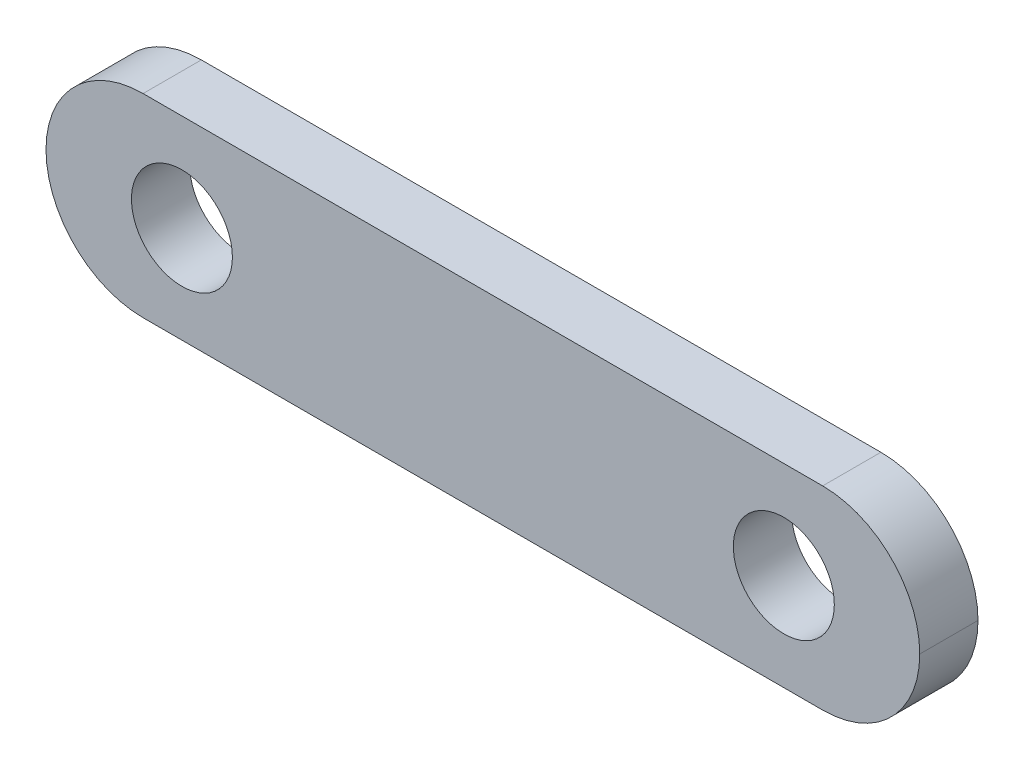
ISO-10303-21;
HEADER;
FILE_DESCRIPTION(('STEP AP214'),'2;1');
FILE_NAME('part.step','',(''),(''),'','','');
FILE_SCHEMA(('AUTOMOTIVE_DESIGN { 1 0 10303 214 1 1 1 1 }'));
ENDSEC;
DATA;
#1=APPLICATION_CONTEXT('core data for automotive mechanical design processes');
#2=APPLICATION_PROTOCOL_DEFINITION('international standard','automotive_design',2000,#1);
#3=PRODUCT_CONTEXT('',#1,'mechanical');
#4=PRODUCT('Part','Part','',(#3));
#5=PRODUCT_RELATED_PRODUCT_CATEGORY('part','',(#4));
#6=PRODUCT_DEFINITION_FORMATION('','',#4);
#7=PRODUCT_DEFINITION_CONTEXT('part definition',#1,'design');
#8=PRODUCT_DEFINITION('design','',#6,#7);
#9=PRODUCT_DEFINITION_SHAPE('','',#8);
#10=(LENGTH_UNIT() NAMED_UNIT(*) SI_UNIT(.MILLI.,.METRE.));
#11=(NAMED_UNIT(*) PLANE_ANGLE_UNIT() SI_UNIT($,.RADIAN.));
#12=(NAMED_UNIT(*) SI_UNIT($,.STERADIAN.) SOLID_ANGLE_UNIT());
#13=UNCERTAINTY_MEASURE_WITH_UNIT(LENGTH_MEASURE(1.E-05),#10,'distance_accuracy_value','');
#14=(GEOMETRIC_REPRESENTATION_CONTEXT(3) GLOBAL_UNCERTAINTY_ASSIGNED_CONTEXT((#13)) GLOBAL_UNIT_ASSIGNED_CONTEXT((#10,
#11,#12)) REPRESENTATION_CONTEXT('',''));
#15=CARTESIAN_POINT('',(0.,0.,0.));
#16=DIRECTION('',(0.,0.,1.));
#17=DIRECTION('',(1.,0.,0.));
#18=AXIS2_PLACEMENT_3D('',#15,#16,#17);
#19=CARTESIAN_POINT('',(-47.7032570422535,1.02306338028169,3.));
#20=DIRECTION('',(0.,1.,0.));
#21=DIRECTION('',(0.,0.,1.));
#22=AXIS2_PLACEMENT_3D('',#19,#20,#21);
#23=PLANE('',#22);
#24=DIRECTION('',(1.,0.,0.));
#25=VECTOR('',#24,1.);
#26=CARTESIAN_POINT('',(-47.7032570422535,1.02306338028169,3.));
#27=LINE('',#26,#25);
#28=CARTESIAN_POINT('',(-42.7032570422535,1.02306338028169,3.));
#29=VERTEX_POINT('',#28);
#30=CARTESIAN_POINT('',(-7.70325704225352,1.02306338028169,3.));
#31=VERTEX_POINT('',#30);
#32=EDGE_CURVE('E107',#29,#31,#27,.T.);
#33=ORIENTED_EDGE('',*,*,#32,.F.);
#34=DIRECTION('',(0.,0.,-1.));
#35=VECTOR('',#34,1.);
#36=CARTESIAN_POINT('',(-42.7032570422535,1.02306338028169,3.));
#37=LINE('',#36,#35);
#38=CARTESIAN_POINT('',(-42.7032570422535,1.02306338028169,0.));
#39=VERTEX_POINT('',#38);
#40=EDGE_CURVE('E91',#29,#39,#37,.T.);
#41=ORIENTED_EDGE('',*,*,#40,.T.);
#42=DIRECTION('',(1.,0.,0.));
#43=VECTOR('',#42,1.);
#44=CARTESIAN_POINT('',(-47.7032570422535,1.02306338028169,0.));
#45=LINE('',#44,#43);
#46=CARTESIAN_POINT('',(-7.70325704225352,1.02306338028169,0.));
#47=VERTEX_POINT('',#46);
#48=EDGE_CURVE('E104',#39,#47,#45,.T.);
#49=ORIENTED_EDGE('',*,*,#48,.T.);
#50=DIRECTION('',(0.,0.,-1.));
#51=VECTOR('',#50,1.);
#52=CARTESIAN_POINT('',(-7.7032570422535,1.02306338028169,3.));
#53=LINE('',#52,#51);
#54=EDGE_CURVE('E108',#47,#31,#53,.F.);
#55=ORIENTED_EDGE('',*,*,#54,.T.);
#56=EDGE_LOOP('',(#33,#41,#49,#55));
#57=FACE_BOUND('',#56,.T.);
#58=ADVANCED_FACE('F36',(#57),#23,.F.);
#59=CARTESIAN_POINT('',(-47.7032570422535,11.0230633802817,3.));
#60=DIRECTION('',(0.,-1.,0.));
#61=DIRECTION('',(0.,0.,-1.));
#62=AXIS2_PLACEMENT_3D('',#59,#60,#61);
#63=PLANE('',#62);
#64=DIRECTION('',(-1.,0.,0.));
#65=VECTOR('',#64,1.);
#66=CARTESIAN_POINT('',(-47.7032570422535,11.0230633802817,3.));
#67=LINE('',#66,#65);
#68=CARTESIAN_POINT('',(-7.70325704225352,11.0230633802817,3.));
#69=VERTEX_POINT('',#68);
#70=CARTESIAN_POINT('',(-42.7032570422535,11.0230633802817,3.));
#71=VERTEX_POINT('',#70);
#72=EDGE_CURVE('E123',#69,#71,#67,.T.);
#73=ORIENTED_EDGE('',*,*,#72,.F.);
#74=DIRECTION('',(0.,0.,-1.));
#75=VECTOR('',#74,1.);
#76=CARTESIAN_POINT('',(-7.7032570422535,11.0230633802817,3.));
#77=LINE('',#76,#75);
#78=CARTESIAN_POINT('',(-7.70325704225352,11.0230633802817,0.));
#79=VERTEX_POINT('',#78);
#80=EDGE_CURVE('E11',#69,#79,#77,.T.);
#81=ORIENTED_EDGE('',*,*,#80,.T.);
#82=DIRECTION('',(-1.,0.,0.));
#83=VECTOR('',#82,1.);
#84=CARTESIAN_POINT('',(-47.7032570422535,11.0230633802817,0.));
#85=LINE('',#84,#83);
#86=CARTESIAN_POINT('',(-42.7032570422535,11.0230633802817,0.));
#87=VERTEX_POINT('',#86);
#88=EDGE_CURVE('E113',#79,#87,#85,.T.);
#89=ORIENTED_EDGE('',*,*,#88,.T.);
#90=DIRECTION('',(0.,0.,-1.));
#91=VECTOR('',#90,1.);
#92=CARTESIAN_POINT('',(-42.7032570422535,11.0230633802817,3.));
#93=LINE('',#92,#91);
#94=EDGE_CURVE('E43',#87,#71,#93,.F.);
#95=ORIENTED_EDGE('',*,*,#94,.T.);
#96=EDGE_LOOP('',(#73,#81,#89,#95));
#97=FACE_BOUND('',#96,.T.);
#98=ADVANCED_FACE('F159',(#97),#63,.F.);
#99=CARTESIAN_POINT('',(-47.7032570422535,1.02306338028169,3.));
#100=DIRECTION('',(0.,0.,1.));
#101=DIRECTION('',(1.,0.,0.));
#102=AXIS2_PLACEMENT_3D('',#99,#100,#101);
#103=PLANE('',#102);
#104=CARTESIAN_POINT('',(-9.70325704225351,6.02306338028169,3.));
#105=DIRECTION('',(0.,0.,1.));
#106=DIRECTION('',(1.,0.,0.));
#107=AXIS2_PLACEMENT_3D('',#104,#105,#106);
#108=CIRCLE('',#107,2.6);
#109=CARTESIAN_POINT('',(-7.10325704225351,6.02306338028169,3.));
#110=VERTEX_POINT('',#109);
#111=EDGE_CURVE('E146',#110,#110,#108,.T.);
#112=ORIENTED_EDGE('',*,*,#111,.F.);
#113=EDGE_LOOP('',(#112));
#114=FACE_BOUND('',#113,.T.);
#115=CARTESIAN_POINT('',(-40.7032570422535,6.02306338028169,3.));
#116=DIRECTION('',(0.,0.,1.));
#117=DIRECTION('',(1.,0.,0.));
#118=AXIS2_PLACEMENT_3D('',#115,#116,#117);
#119=CIRCLE('',#118,2.6);
#120=CARTESIAN_POINT('',(-38.1032570422535,6.02306338028169,3.));
#121=VERTEX_POINT('',#120);
#122=EDGE_CURVE('E118',#121,#121,#119,.T.);
#123=ORIENTED_EDGE('',*,*,#122,.F.);
#124=EDGE_LOOP('',(#123));
#125=FACE_BOUND('',#124,.T.);
#126=ORIENTED_EDGE('',*,*,#32,.T.);
#127=CARTESIAN_POINT('',(-7.70325704225351,6.02306338028169,3.));
#128=DIRECTION('',(0.,0.,1.));
#129=DIRECTION('',(1.,0.,0.));
#130=AXIS2_PLACEMENT_3D('',#127,#128,#129);
#131=CIRCLE('',#130,5.);
#132=CARTESIAN_POINT('',(-2.70325704225351,6.02306338028169,3.));
#133=VERTEX_POINT('',#132);
#134=EDGE_CURVE('E134',#31,#133,#131,.T.);
#135=ORIENTED_EDGE('',*,*,#134,.T.);
#136=CARTESIAN_POINT('',(-7.7032570422535,6.02306338028169,3.));
#137=DIRECTION('',(0.,0.,1.));
#138=DIRECTION('',(1.,0.,0.));
#139=AXIS2_PLACEMENT_3D('',#136,#137,#138);
#140=CIRCLE('',#139,5.);
#141=EDGE_CURVE('E56',#133,#69,#140,.T.);
#142=ORIENTED_EDGE('',*,*,#141,.T.);
#143=ORIENTED_EDGE('',*,*,#72,.T.);
#144=CARTESIAN_POINT('',(-42.7032570422535,6.02306338028169,3.));
#145=DIRECTION('',(0.,0.,1.));
#146=DIRECTION('',(1.,0.,0.));
#147=AXIS2_PLACEMENT_3D('',#144,#145,#146);
#148=CIRCLE('',#147,5.);
#149=CARTESIAN_POINT('',(-47.7032570422535,6.02306338028169,3.));
#150=VERTEX_POINT('',#149);
#151=EDGE_CURVE('E129',#71,#150,#148,.T.);
#152=ORIENTED_EDGE('',*,*,#151,.T.);
#153=CARTESIAN_POINT('',(-42.7032570422535,6.02306338028169,3.));
#154=DIRECTION('',(0.,0.,1.));
#155=DIRECTION('',(1.,0.,0.));
#156=AXIS2_PLACEMENT_3D('',#153,#154,#155);
#157=CIRCLE('',#156,5.);
#158=EDGE_CURVE('E131',#150,#29,#157,.T.);
#159=ORIENTED_EDGE('',*,*,#158,.T.);
#160=EDGE_LOOP('',(#126,#135,#142,#143,#152,#159));
#161=FACE_BOUND('',#160,.T.);
#162=ADVANCED_FACE('F135',(#114,#125,#161),#103,.T.);
#163=CARTESIAN_POINT('',(-47.7032570422535,1.02306338028169,0.));
#164=DIRECTION('',(0.,0.,1.));
#165=DIRECTION('',(1.,0.,0.));
#166=AXIS2_PLACEMENT_3D('',#163,#164,#165);
#167=PLANE('',#166);
#168=CARTESIAN_POINT('',(-9.70325704225351,6.02306338028169,0.));
#169=DIRECTION('',(0.,0.,1.));
#170=DIRECTION('',(1.,0.,0.));
#171=AXIS2_PLACEMENT_3D('',#168,#169,#170);
#172=CIRCLE('',#171,2.6);
#173=CARTESIAN_POINT('',(-7.10325704225351,6.02306338028169,0.));
#174=VERTEX_POINT('',#173);
#175=EDGE_CURVE('E151',#174,#174,#172,.T.);
#176=ORIENTED_EDGE('',*,*,#175,.T.);
#177=EDGE_LOOP('',(#176));
#178=FACE_BOUND('',#177,.T.);
#179=CARTESIAN_POINT('',(-40.7032570422535,6.02306338028169,0.));
#180=DIRECTION('',(0.,0.,1.));
#181=DIRECTION('',(1.,0.,0.));
#182=AXIS2_PLACEMENT_3D('',#179,#180,#181);
#183=CIRCLE('',#182,2.6);
#184=CARTESIAN_POINT('',(-38.1032570422535,6.02306338028169,0.));
#185=VERTEX_POINT('',#184);
#186=EDGE_CURVE('E114',#185,#185,#183,.T.);
#187=ORIENTED_EDGE('',*,*,#186,.T.);
#188=EDGE_LOOP('',(#187));
#189=FACE_BOUND('',#188,.T.);
#190=CARTESIAN_POINT('',(-7.7032570422535,6.02306338028169,0.));
#191=DIRECTION('',(0.,0.,1.));
#192=DIRECTION('',(1.,0.,0.));
#193=AXIS2_PLACEMENT_3D('',#190,#191,#192);
#194=CIRCLE('',#193,5.);
#195=CARTESIAN_POINT('',(-2.70325704225351,6.02306338028169,0.));
#196=VERTEX_POINT('',#195);
#197=EDGE_CURVE('E97',#79,#196,#194,.F.);
#198=ORIENTED_EDGE('',*,*,#197,.T.);
#199=CARTESIAN_POINT('',(-7.70325704225351,6.02306338028169,0.));
#200=DIRECTION('',(0.,0.,1.));
#201=DIRECTION('',(1.,0.,0.));
#202=AXIS2_PLACEMENT_3D('',#199,#200,#201);
#203=CIRCLE('',#202,5.);
#204=EDGE_CURVE('E112',#196,#47,#203,.F.);
#205=ORIENTED_EDGE('',*,*,#204,.T.);
#206=ORIENTED_EDGE('',*,*,#48,.F.);
#207=CARTESIAN_POINT('',(-42.7032570422535,6.02306338028169,0.));
#208=DIRECTION('',(0.,0.,1.));
#209=DIRECTION('',(1.,0.,0.));
#210=AXIS2_PLACEMENT_3D('',#207,#208,#209);
#211=CIRCLE('',#210,5.);
#212=CARTESIAN_POINT('',(-47.7032570422535,6.02306338028169,0.));
#213=VERTEX_POINT('',#212);
#214=EDGE_CURVE('E87',#39,#213,#211,.F.);
#215=ORIENTED_EDGE('',*,*,#214,.T.);
#216=CARTESIAN_POINT('',(-42.7032570422535,6.02306338028169,0.));
#217=DIRECTION('',(0.,0.,1.));
#218=DIRECTION('',(1.,0.,0.));
#219=AXIS2_PLACEMENT_3D('',#216,#217,#218);
#220=CIRCLE('',#219,5.);
#221=EDGE_CURVE('E98',#213,#87,#220,.F.);
#222=ORIENTED_EDGE('',*,*,#221,.T.);
#223=ORIENTED_EDGE('',*,*,#88,.F.);
#224=EDGE_LOOP('',(#198,#205,#206,#215,#222,#223));
#225=FACE_BOUND('',#224,.T.);
#226=ADVANCED_FACE('F110',(#178,#189,#225),#167,.F.);
#227=CARTESIAN_POINT('',(-40.7032570422535,6.02306338028169,0.));
#228=DIRECTION('',(0.,0.,1.));
#229=DIRECTION('',(1.,0.,0.));
#230=AXIS2_PLACEMENT_3D('',#227,#228,#229);
#231=CYLINDRICAL_SURFACE('',#230,2.6);
#232=ORIENTED_EDGE('',*,*,#186,.F.);
#233=EDGE_LOOP('',(#232));
#234=FACE_BOUND('',#233,.T.);
#235=ORIENTED_EDGE('',*,*,#122,.T.);
#236=EDGE_LOOP('',(#235));
#237=FACE_BOUND('',#236,.T.);
#238=ADVANCED_FACE('F156',(#234,#237),#231,.F.);
#239=CARTESIAN_POINT('',(-9.70325704225351,6.02306338028169,0.));
#240=DIRECTION('',(0.,0.,1.));
#241=DIRECTION('',(1.,0.,0.));
#242=AXIS2_PLACEMENT_3D('',#239,#240,#241);
#243=CYLINDRICAL_SURFACE('',#242,2.6);
#244=ORIENTED_EDGE('',*,*,#175,.F.);
#245=EDGE_LOOP('',(#244));
#246=FACE_BOUND('',#245,.T.);
#247=ORIENTED_EDGE('',*,*,#111,.T.);
#248=EDGE_LOOP('',(#247));
#249=FACE_BOUND('',#248,.T.);
#250=ADVANCED_FACE('F199',(#246,#249),#243,.F.);
#251=CARTESIAN_POINT('',(-42.7032570422535,6.02306338028169,3.));
#252=DIRECTION('',(0.,0.,-1.));
#253=DIRECTION('',(-1.,0.,0.));
#254=AXIS2_PLACEMENT_3D('',#251,#252,#253);
#255=CYLINDRICAL_SURFACE('',#254,5.);
#256=DIRECTION('',(0.,0.,-1.));
#257=VECTOR('',#256,1.);
#258=CARTESIAN_POINT('',(-47.7032570422535,6.02306338028169,3.));
#259=LINE('',#258,#257);
#260=EDGE_CURVE('E93',#150,#213,#259,.T.);
#261=ORIENTED_EDGE('',*,*,#260,.F.);
#262=ORIENTED_EDGE('',*,*,#151,.F.);
#263=ORIENTED_EDGE('',*,*,#94,.F.);
#264=ORIENTED_EDGE('',*,*,#221,.F.);
#265=EDGE_LOOP('',(#261,#262,#263,#264));
#266=FACE_BOUND('',#265,.T.);
#267=ADVANCED_FACE('F194',(#266),#255,.T.);
#268=CARTESIAN_POINT('',(-42.7032570422535,6.02306338028169,3.));
#269=DIRECTION('',(0.,0.,-1.));
#270=DIRECTION('',(-1.,0.,0.));
#271=AXIS2_PLACEMENT_3D('',#268,#269,#270);
#272=CYLINDRICAL_SURFACE('',#271,5.);
#273=ORIENTED_EDGE('',*,*,#158,.F.);
#274=ORIENTED_EDGE('',*,*,#260,.T.);
#275=ORIENTED_EDGE('',*,*,#214,.F.);
#276=ORIENTED_EDGE('',*,*,#40,.F.);
#277=EDGE_LOOP('',(#273,#274,#275,#276));
#278=FACE_BOUND('',#277,.T.);
#279=ADVANCED_FACE('F90',(#278),#272,.T.);
#280=CARTESIAN_POINT('',(-7.7032570422535,6.02306338028169,3.));
#281=DIRECTION('',(0.,0.,-1.));
#282=DIRECTION('',(-1.,0.,0.));
#283=AXIS2_PLACEMENT_3D('',#280,#281,#282);
#284=CYLINDRICAL_SURFACE('',#283,5.);
#285=ORIENTED_EDGE('',*,*,#80,.F.);
#286=ORIENTED_EDGE('',*,*,#141,.F.);
#287=DIRECTION('',(0.,0.,-1.));
#288=VECTOR('',#287,1.);
#289=CARTESIAN_POINT('',(-2.70325704225351,6.02306338028169,3.));
#290=LINE('',#289,#288);
#291=EDGE_CURVE('E143',#196,#133,#290,.F.);
#292=ORIENTED_EDGE('',*,*,#291,.F.);
#293=ORIENTED_EDGE('',*,*,#197,.F.);
#294=EDGE_LOOP('',(#285,#286,#292,#293));
#295=FACE_BOUND('',#294,.T.);
#296=ADVANCED_FACE('F141',(#295),#284,.T.);
#297=CARTESIAN_POINT('',(-7.70325704225351,6.02306338028169,3.));
#298=DIRECTION('',(0.,0.,-1.));
#299=DIRECTION('',(-1.,0.,0.));
#300=AXIS2_PLACEMENT_3D('',#297,#298,#299);
#301=CYLINDRICAL_SURFACE('',#300,5.);
#302=ORIENTED_EDGE('',*,*,#134,.F.);
#303=ORIENTED_EDGE('',*,*,#54,.F.);
#304=ORIENTED_EDGE('',*,*,#204,.F.);
#305=ORIENTED_EDGE('',*,*,#291,.T.);
#306=EDGE_LOOP('',(#302,#303,#304,#305));
#307=FACE_BOUND('',#306,.T.);
#308=ADVANCED_FACE('F144',(#307),#301,.T.);
#309=CLOSED_SHELL('',(#58,#98,#162,#226,#238,#250,#267,#279,#296,#308));
#310=MANIFOLD_SOLID_BREP('B2',#309);
#311=ADVANCED_BREP_SHAPE_REPRESENTATION('',(#18,#310),#14);
#312=SHAPE_DEFINITION_REPRESENTATION(#9,#311);
ENDSEC;
END-ISO-10303-21;
